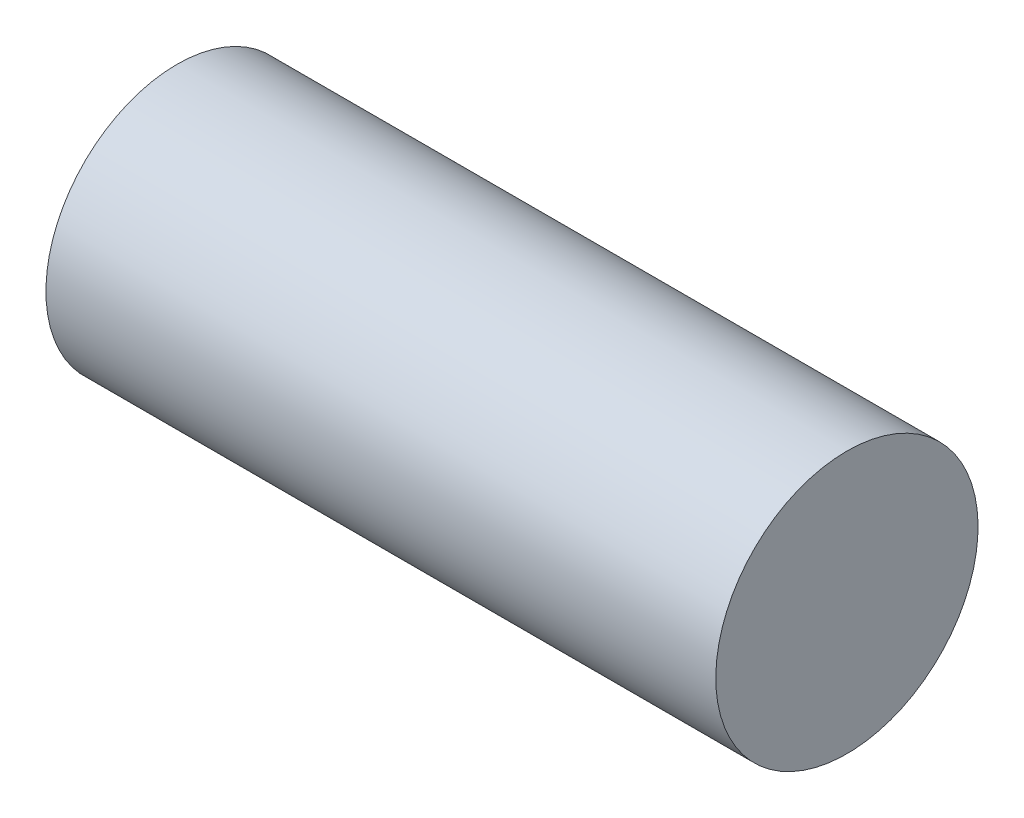
ISO-10303-21;
HEADER;
FILE_DESCRIPTION(('STEP AP214'),'2;1');
FILE_NAME('part.step','',(''),(''),'','','');
FILE_SCHEMA(('AUTOMOTIVE_DESIGN { 1 0 10303 214 1 1 1 1 }'));
ENDSEC;
DATA;
#1=APPLICATION_CONTEXT('core data for automotive mechanical design processes');
#2=APPLICATION_PROTOCOL_DEFINITION('international standard','automotive_design',2000,#1);
#3=PRODUCT_CONTEXT('',#1,'mechanical');
#4=PRODUCT('Part','Part','',(#3));
#5=PRODUCT_RELATED_PRODUCT_CATEGORY('part','',(#4));
#6=PRODUCT_DEFINITION_FORMATION('','',#4);
#7=PRODUCT_DEFINITION_CONTEXT('part definition',#1,'design');
#8=PRODUCT_DEFINITION('design','',#6,#7);
#9=PRODUCT_DEFINITION_SHAPE('','',#8);
#10=(LENGTH_UNIT() NAMED_UNIT(*) SI_UNIT(.MILLI.,.METRE.));
#11=(NAMED_UNIT(*) PLANE_ANGLE_UNIT() SI_UNIT($,.RADIAN.));
#12=(NAMED_UNIT(*) SI_UNIT($,.STERADIAN.) SOLID_ANGLE_UNIT());
#13=UNCERTAINTY_MEASURE_WITH_UNIT(LENGTH_MEASURE(1.E-05),#10,'distance_accuracy_value','');
#14=(GEOMETRIC_REPRESENTATION_CONTEXT(3) GLOBAL_UNCERTAINTY_ASSIGNED_CONTEXT((#13)) GLOBAL_UNIT_ASSIGNED_CONTEXT((#10,
#11,#12)) REPRESENTATION_CONTEXT('',''));
#15=CARTESIAN_POINT('',(0.,0.,0.));
#16=DIRECTION('',(0.,0.,1.));
#17=DIRECTION('',(1.,0.,0.));
#18=AXIS2_PLACEMENT_3D('',#15,#16,#17);
#19=CARTESIAN_POINT('',(-8.80000190734866,-17.7940408907831,-22.0648896113038));
#20=DIRECTION('',(1.,0.,0.));
#21=DIRECTION('',(0.,1.,0.));
#22=AXIS2_PLACEMENT_3D('',#19,#20,#21);
#23=CYLINDRICAL_SURFACE('',#22,2.65);
#24=CARTESIAN_POINT('',(7.99999809265134,-17.7940408907831,-22.0648896113038));
#25=DIRECTION('',(1.,0.,0.));
#26=DIRECTION('',(0.,1.,0.));
#27=AXIS2_PLACEMENT_3D('',#24,#25,#26);
#28=CIRCLE('',#27,2.65);
#29=CARTESIAN_POINT('',(7.99999809265134,-19.9440408330712,-20.5156961927271));
#30=VERTEX_POINT('',#29);
#31=CARTESIAN_POINT('',(7.99999809265134,-19.9440409484951,-23.614082869693));
#32=VERTEX_POINT('',#31);
#33=EDGE_CURVE('E65',#30,#32,#28,.F.);
#34=ORIENTED_EDGE('',*,*,#33,.F.);
#35=DIRECTION('',(1.,0.,0.));
#36=VECTOR('',#35,1.);
#37=CARTESIAN_POINT('',(-8.80000190734866,-19.9440408330712,-20.5156961927271));
#38=LINE('',#37,#36);
#39=CARTESIAN_POINT('',(-8.80000190734866,-19.9440408330712,-20.5156961927271));
#40=VERTEX_POINT('',#39);
#41=EDGE_CURVE('E13',#40,#30,#38,.T.);
#42=ORIENTED_EDGE('',*,*,#41,.F.);
#43=CARTESIAN_POINT('',(-8.80000190734866,-17.7940408907831,-22.0648896113038));
#44=DIRECTION('',(1.,0.,0.));
#45=DIRECTION('',(0.,0.,-1.));
#46=AXIS2_PLACEMENT_3D('',#43,#44,#45);
#47=CIRCLE('',#46,2.65);
#48=CARTESIAN_POINT('',(-8.80000190734866,-19.9440409484951,-23.614082869693));
#49=VERTEX_POINT('',#48);
#50=EDGE_CURVE('E72',#49,#40,#47,.T.);
#51=ORIENTED_EDGE('',*,*,#50,.F.);
#52=DIRECTION('',(1.,0.,0.));
#53=VECTOR('',#52,1.);
#54=CARTESIAN_POINT('',(-8.80000190734866,-19.9440409484951,-23.614082869693));
#55=LINE('',#54,#53);
#56=EDGE_CURVE('E55',#49,#32,#55,.T.);
#57=ORIENTED_EDGE('',*,*,#56,.T.);
#58=EDGE_LOOP('',(#34,#42,#51,#57));
#59=FACE_BOUND('',#58,.T.);
#60=ADVANCED_FACE('F52',(#59),#23,.F.);
#61=CARTESIAN_POINT('',(-8.80000190734866,-19.9440400688019,7.42973420156355E-07));
#62=DIRECTION('',(0.,0.999999999999999,-3.72529045300806E-08));
#63=DIRECTION('',(0.,3.72529045300806E-08,0.999999999999999));
#64=AXIS2_PLACEMENT_3D('',#61,#62,#63);
#65=PLANE('',#64);
#66=ORIENTED_EDGE('',*,*,#41,.T.);
#67=DIRECTION('',(0.,-3.72529045300806E-08,-0.999999999999999));
#68=VECTOR('',#67,1.);
#69=CARTESIAN_POINT('',(7.99999809265134,-19.9440400688019,7.42973420627178E-07));
#70=LINE('',#69,#68);
#71=EDGE_CURVE('E78',#30,#32,#70,.T.);
#72=ORIENTED_EDGE('',*,*,#71,.T.);
#73=ORIENTED_EDGE('',*,*,#56,.F.);
#74=DIRECTION('',(0.,3.72529045300806E-08,0.999999999999999));
#75=VECTOR('',#74,1.);
#76=CARTESIAN_POINT('',(-8.80000190734866,-19.9440400688019,7.42973420156355E-07));
#77=LINE('',#76,#75);
#78=EDGE_CURVE('E88',#49,#40,#77,.T.);
#79=ORIENTED_EDGE('',*,*,#78,.T.);
#80=EDGE_LOOP('',(#66,#72,#73,#79));
#81=FACE_BOUND('',#80,.T.);
#82=ADVANCED_FACE('F87',(#81),#65,.T.);
#83=CARTESIAN_POINT('',(-8.80000190734866,-17.7940408907831,-22.0648896113038));
#84=DIRECTION('',(1.,0.,0.));
#85=DIRECTION('',(0.,1.,0.));
#86=AXIS2_PLACEMENT_3D('',#83,#84,#85);
#87=CYLINDRICAL_SURFACE('',#86,3.45);
#88=CARTESIAN_POINT('',(8.82499809297896,-17.7940408907831,-22.0648896113038));
#89=DIRECTION('',(1.,0.,0.));
#90=DIRECTION('',(0.,1.,0.));
#91=AXIS2_PLACEMENT_3D('',#88,#89,#90);
#92=CIRCLE('',#91,3.45);
#93=CARTESIAN_POINT('',(8.82499809297896,-14.3440408907831,-22.0648896113038));
#94=VERTEX_POINT('',#93);
#95=EDGE_CURVE('E82',#94,#94,#92,.T.);
#96=ORIENTED_EDGE('',*,*,#95,.F.);
#97=EDGE_LOOP('',(#96));
#98=FACE_BOUND('',#97,.T.);
#99=CARTESIAN_POINT('',(-8.80000190734866,-17.7940408907831,-22.0648896113038));
#100=DIRECTION('',(1.,0.,0.));
#101=DIRECTION('',(0.,0.,-1.));
#102=AXIS2_PLACEMENT_3D('',#99,#100,#101);
#103=CIRCLE('',#102,3.45);
#104=CARTESIAN_POINT('',(-8.80000190734866,-17.7940408907831,-25.5148896113038));
#105=VERTEX_POINT('',#104);
#106=EDGE_CURVE('E89',#105,#105,#103,.T.);
#107=ORIENTED_EDGE('',*,*,#106,.T.);
#108=EDGE_LOOP('',(#107));
#109=FACE_BOUND('',#108,.T.);
#110=ADVANCED_FACE('F100',(#98,#109),#87,.T.);
#111=CARTESIAN_POINT('',(-8.80000190734866,0.,0.));
#112=DIRECTION('',(1.,0.,0.));
#113=DIRECTION('',(0.,0.,-1.));
#114=AXIS2_PLACEMENT_3D('',#111,#112,#113);
#115=PLANE('',#114);
#116=ORIENTED_EDGE('',*,*,#50,.T.);
#117=ORIENTED_EDGE('',*,*,#78,.F.);
#118=EDGE_LOOP('',(#116,#117));
#119=FACE_BOUND('',#118,.T.);
#120=ORIENTED_EDGE('',*,*,#106,.F.);
#121=EDGE_LOOP('',(#120));
#122=FACE_BOUND('',#121,.T.);
#123=ADVANCED_FACE('F103',(#119,#122),#115,.F.);
#124=CARTESIAN_POINT('',(8.82499809297896,-17.7940408907831,-22.0648896113038));
#125=DIRECTION('',(1.,0.,0.));
#126=DIRECTION('',(0.,-0.996624782991237,-0.0820916678333982));
#127=AXIS2_PLACEMENT_3D('',#124,#125,#126);
#128=PLANE('',#127);
#129=ORIENTED_EDGE('',*,*,#95,.T.);
#130=EDGE_LOOP('',(#129));
#131=FACE_BOUND('',#130,.T.);
#132=ADVANCED_FACE('F98',(#131),#128,.T.);
#133=CARTESIAN_POINT('',(7.99999809265134,-17.7940408907831,-22.0648896113038));
#134=DIRECTION('',(1.,0.,0.));
#135=DIRECTION('',(0.,1.,0.));
#136=AXIS2_PLACEMENT_3D('',#133,#134,#135);
#137=PLANE('',#136);
#138=ORIENTED_EDGE('',*,*,#71,.F.);
#139=ORIENTED_EDGE('',*,*,#33,.T.);
#140=EDGE_LOOP('',(#138,#139));
#141=FACE_BOUND('',#140,.T.);
#142=ADVANCED_FACE('F79',(#141),#137,.F.);
#143=CLOSED_SHELL('',(#60,#82,#110,#123,#132,#142));
#144=MANIFOLD_SOLID_BREP('B2',#143);
#145=ADVANCED_BREP_SHAPE_REPRESENTATION('',(#18,#144),#14);
#146=SHAPE_DEFINITION_REPRESENTATION(#9,#145);
ENDSEC;
END-ISO-10303-21;
